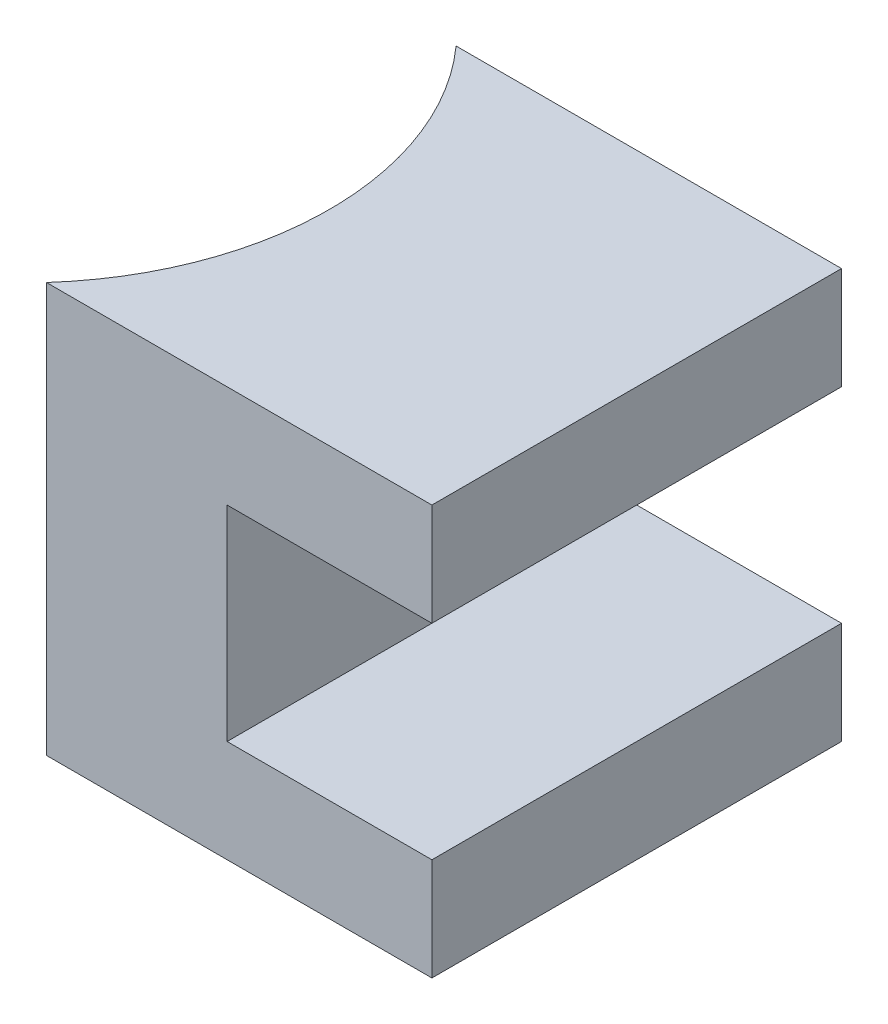
ISO-10303-21;
HEADER;
FILE_DESCRIPTION(('STEP AP214'),'2;1');
FILE_NAME('part.step','',(''),(''),'','','');
FILE_SCHEMA(('AUTOMOTIVE_DESIGN { 1 0 10303 214 1 1 1 1 }'));
ENDSEC;
DATA;
#1=APPLICATION_CONTEXT('core data for automotive mechanical design processes');
#2=APPLICATION_PROTOCOL_DEFINITION('international standard','automotive_design',2000,#1);
#3=PRODUCT_CONTEXT('',#1,'mechanical');
#4=PRODUCT('Part','Part','',(#3));
#5=PRODUCT_RELATED_PRODUCT_CATEGORY('part','',(#4));
#6=PRODUCT_DEFINITION_FORMATION('','',#4);
#7=PRODUCT_DEFINITION_CONTEXT('part definition',#1,'design');
#8=PRODUCT_DEFINITION('design','',#6,#7);
#9=PRODUCT_DEFINITION_SHAPE('','',#8);
#10=(LENGTH_UNIT() NAMED_UNIT(*) SI_UNIT(.MILLI.,.METRE.));
#11=(NAMED_UNIT(*) PLANE_ANGLE_UNIT() SI_UNIT($,.RADIAN.));
#12=(NAMED_UNIT(*) SI_UNIT($,.STERADIAN.) SOLID_ANGLE_UNIT());
#13=UNCERTAINTY_MEASURE_WITH_UNIT(LENGTH_MEASURE(1.E-05),#10,'distance_accuracy_value','');
#14=(GEOMETRIC_REPRESENTATION_CONTEXT(3) GLOBAL_UNCERTAINTY_ASSIGNED_CONTEXT((#13)) GLOBAL_UNIT_ASSIGNED_CONTEXT((#10,
#11,#12)) REPRESENTATION_CONTEXT('',''));
#15=CARTESIAN_POINT('',(0.,0.,0.));
#16=DIRECTION('',(0.,0.,1.));
#17=DIRECTION('',(1.,0.,0.));
#18=AXIS2_PLACEMENT_3D('',#15,#16,#17);
#19=CARTESIAN_POINT('',(30.,10.,-10.));
#20=DIRECTION('',(-1.,0.,0.));
#21=DIRECTION('',(0.,0.,1.));
#22=AXIS2_PLACEMENT_3D('',#19,#20,#21);
#23=PLANE('',#22);
#24=DIRECTION('',(0.,-1.,0.));
#25=VECTOR('',#24,1.);
#26=CARTESIAN_POINT('',(30.,10.,10.));
#27=LINE('',#26,#25);
#28=CARTESIAN_POINT('',(30.,10.,10.));
#29=VERTEX_POINT('',#28);
#30=CARTESIAN_POINT('',(30.,5.,10.));
#31=VERTEX_POINT('',#30);
#32=EDGE_CURVE('E185',#29,#31,#27,.T.);
#33=ORIENTED_EDGE('',*,*,#32,.T.);
#34=DIRECTION('',(0.,0.,-1.));
#35=VECTOR('',#34,1.);
#36=CARTESIAN_POINT('',(30.,5.,-10.));
#37=LINE('',#36,#35);
#38=CARTESIAN_POINT('',(30.,5.,-10.));
#39=VERTEX_POINT('',#38);
#40=EDGE_CURVE('E143',#31,#39,#37,.T.);
#41=ORIENTED_EDGE('',*,*,#40,.T.);
#42=DIRECTION('',(0.,-1.,0.));
#43=VECTOR('',#42,1.);
#44=CARTESIAN_POINT('',(30.,10.,-10.));
#45=LINE('',#44,#43);
#46=CARTESIAN_POINT('',(30.,10.,-10.));
#47=VERTEX_POINT('',#46);
#48=EDGE_CURVE('E181',#47,#39,#45,.T.);
#49=ORIENTED_EDGE('',*,*,#48,.F.);
#50=DIRECTION('',(0.,0.,-1.));
#51=VECTOR('',#50,1.);
#52=CARTESIAN_POINT('',(30.,10.,-10.));
#53=LINE('',#52,#51);
#54=EDGE_CURVE('E159',#29,#47,#53,.T.);
#55=ORIENTED_EDGE('',*,*,#54,.F.);
#56=EDGE_LOOP('',(#33,#41,#49,#55));
#57=FACE_BOUND('',#56,.T.);
#58=ADVANCED_FACE('F39',(#57),#23,.F.);
#59=CARTESIAN_POINT('',(0.,10.,0.));
#60=DIRECTION('',(0.,-1.,0.));
#61=DIRECTION('',(0.,0.,-1.));
#62=AXIS2_PLACEMENT_3D('',#59,#60,#61);
#63=CYLINDRICAL_SURFACE('',#62,15.);
#64=CARTESIAN_POINT('',(0.,-10.,0.));
#65=DIRECTION('',(0.,-1.,0.));
#66=DIRECTION('',(0.,0.,1.));
#67=AXIS2_PLACEMENT_3D('',#64,#65,#66);
#68=CIRCLE('',#67,15.);
#69=CARTESIAN_POINT('',(11.180339887499,-10.,-10.));
#70=VERTEX_POINT('',#69);
#71=CARTESIAN_POINT('',(11.1803398874989,-10.,10.));
#72=VERTEX_POINT('',#71);
#73=EDGE_CURVE('E153',#70,#72,#68,.T.);
#74=ORIENTED_EDGE('',*,*,#73,.T.);
#75=DIRECTION('',(0.,-1.,0.));
#76=VECTOR('',#75,1.);
#77=CARTESIAN_POINT('',(11.1803398874989,10.,10.));
#78=LINE('',#77,#76);
#79=CARTESIAN_POINT('',(11.1803398874989,10.,10.));
#80=VERTEX_POINT('',#79);
#81=EDGE_CURVE('E48',#80,#72,#78,.T.);
#82=ORIENTED_EDGE('',*,*,#81,.F.);
#83=CARTESIAN_POINT('',(0.,10.,0.));
#84=DIRECTION('',(0.,-1.,0.));
#85=DIRECTION('',(0.,0.,1.));
#86=AXIS2_PLACEMENT_3D('',#83,#84,#85);
#87=CIRCLE('',#86,15.);
#88=CARTESIAN_POINT('',(11.180339887499,10.,-10.));
#89=VERTEX_POINT('',#88);
#90=EDGE_CURVE('E154',#89,#80,#87,.T.);
#91=ORIENTED_EDGE('',*,*,#90,.F.);
#92=DIRECTION('',(0.,-1.,0.));
#93=VECTOR('',#92,1.);
#94=CARTESIAN_POINT('',(11.180339887499,10.,-10.));
#95=LINE('',#94,#93);
#96=EDGE_CURVE('E164',#89,#70,#95,.T.);
#97=ORIENTED_EDGE('',*,*,#96,.T.);
#98=EDGE_LOOP('',(#74,#82,#91,#97));
#99=FACE_BOUND('',#98,.T.);
#100=ADVANCED_FACE('F41',(#99),#63,.F.);
#101=CARTESIAN_POINT('',(30.,10.,10.));
#102=DIRECTION('',(0.,0.,-1.));
#103=DIRECTION('',(-1.,0.,0.));
#104=AXIS2_PLACEMENT_3D('',#101,#102,#103);
#105=PLANE('',#104);
#106=DIRECTION('',(0.,1.,0.));
#107=VECTOR('',#106,1.);
#108=CARTESIAN_POINT('',(20.,10.,10.));
#109=LINE('',#108,#107);
#110=CARTESIAN_POINT('',(20.,-5.,10.));
#111=VERTEX_POINT('',#110);
#112=CARTESIAN_POINT('',(20.,5.,10.));
#113=VERTEX_POINT('',#112);
#114=EDGE_CURVE('E121',#111,#113,#109,.T.);
#115=ORIENTED_EDGE('',*,*,#114,.T.);
#116=DIRECTION('',(1.,0.,0.));
#117=VECTOR('',#116,1.);
#118=CARTESIAN_POINT('',(30.,5.,10.));
#119=LINE('',#118,#117);
#120=EDGE_CURVE('E147',#113,#31,#119,.T.);
#121=ORIENTED_EDGE('',*,*,#120,.T.);
#122=ORIENTED_EDGE('',*,*,#32,.F.);
#123=DIRECTION('',(1.,0.,0.));
#124=VECTOR('',#123,1.);
#125=CARTESIAN_POINT('',(30.,10.,10.));
#126=LINE('',#125,#124);
#127=EDGE_CURVE('E92',#80,#29,#126,.T.);
#128=ORIENTED_EDGE('',*,*,#127,.F.);
#129=ORIENTED_EDGE('',*,*,#81,.T.);
#130=DIRECTION('',(1.,0.,0.));
#131=VECTOR('',#130,1.);
#132=CARTESIAN_POINT('',(30.,-10.,10.));
#133=LINE('',#132,#131);
#134=CARTESIAN_POINT('',(30.,-10.,10.));
#135=VERTEX_POINT('',#134);
#136=EDGE_CURVE('E168',#72,#135,#133,.T.);
#137=ORIENTED_EDGE('',*,*,#136,.T.);
#138=CARTESIAN_POINT('',(30.,-5.,10.));
#139=VERTEX_POINT('',#138);
#140=EDGE_CURVE('E184',#139,#135,#27,.T.);
#141=ORIENTED_EDGE('',*,*,#140,.F.);
#142=DIRECTION('',(-1.,0.,0.));
#143=VECTOR('',#142,1.);
#144=CARTESIAN_POINT('',(30.,-5.,10.));
#145=LINE('',#144,#143);
#146=EDGE_CURVE('E140',#139,#111,#145,.T.);
#147=ORIENTED_EDGE('',*,*,#146,.T.);
#148=EDGE_LOOP('',(#115,#121,#122,#128,#129,#137,#141,#147));
#149=FACE_BOUND('',#148,.T.);
#150=ADVANCED_FACE('F190',(#149),#105,.F.);
#151=CARTESIAN_POINT('',(30.,-5.,-10.));
#152=VERTEX_POINT('',#151);
#153=CARTESIAN_POINT('',(30.,-10.,-10.));
#154=VERTEX_POINT('',#153);
#155=EDGE_CURVE('E180',#152,#154,#45,.T.);
#156=ORIENTED_EDGE('',*,*,#155,.F.);
#157=DIRECTION('',(0.,0.,1.));
#158=VECTOR('',#157,1.);
#159=CARTESIAN_POINT('',(30.,-5.,-10.));
#160=LINE('',#159,#158);
#161=EDGE_CURVE('E55',#152,#139,#160,.T.);
#162=ORIENTED_EDGE('',*,*,#161,.T.);
#163=ORIENTED_EDGE('',*,*,#140,.T.);
#164=DIRECTION('',(0.,0.,-1.));
#165=VECTOR('',#164,1.);
#166=CARTESIAN_POINT('',(30.,-10.,-10.));
#167=LINE('',#166,#165);
#168=EDGE_CURVE('E172',#135,#154,#167,.T.);
#169=ORIENTED_EDGE('',*,*,#168,.T.);
#170=EDGE_LOOP('',(#156,#162,#163,#169));
#171=FACE_BOUND('',#170,.T.);
#172=ADVANCED_FACE('F199',(#171),#23,.F.);
#173=CARTESIAN_POINT('',(11.180339887499,10.,-10.));
#174=DIRECTION('',(0.,0.,1.));
#175=DIRECTION('',(1.,0.,0.));
#176=AXIS2_PLACEMENT_3D('',#173,#174,#175);
#177=PLANE('',#176);
#178=ORIENTED_EDGE('',*,*,#48,.T.);
#179=DIRECTION('',(-1.,0.,0.));
#180=VECTOR('',#179,1.);
#181=CARTESIAN_POINT('',(11.180339887499,5.,-10.));
#182=LINE('',#181,#180);
#183=CARTESIAN_POINT('',(20.,5.,-10.));
#184=VERTEX_POINT('',#183);
#185=EDGE_CURVE('E11',#39,#184,#182,.T.);
#186=ORIENTED_EDGE('',*,*,#185,.T.);
#187=DIRECTION('',(0.,-1.,0.));
#188=VECTOR('',#187,1.);
#189=CARTESIAN_POINT('',(20.,-5.,-10.));
#190=LINE('',#189,#188);
#191=CARTESIAN_POINT('',(20.,-5.,-10.));
#192=VERTEX_POINT('',#191);
#193=EDGE_CURVE('E119',#184,#192,#190,.T.);
#194=ORIENTED_EDGE('',*,*,#193,.T.);
#195=DIRECTION('',(1.,0.,0.));
#196=VECTOR('',#195,1.);
#197=CARTESIAN_POINT('',(35.2084250392566,-5.,-10.));
#198=LINE('',#197,#196);
#199=EDGE_CURVE('E125',#192,#152,#198,.T.);
#200=ORIENTED_EDGE('',*,*,#199,.T.);
#201=ORIENTED_EDGE('',*,*,#155,.T.);
#202=DIRECTION('',(-1.,0.,0.));
#203=VECTOR('',#202,1.);
#204=CARTESIAN_POINT('',(11.180339887499,-10.,-10.));
#205=LINE('',#204,#203);
#206=EDGE_CURVE('E84',#154,#70,#205,.T.);
#207=ORIENTED_EDGE('',*,*,#206,.T.);
#208=ORIENTED_EDGE('',*,*,#96,.F.);
#209=DIRECTION('',(-1.,0.,0.));
#210=VECTOR('',#209,1.);
#211=CARTESIAN_POINT('',(11.180339887499,10.,-10.));
#212=LINE('',#211,#210);
#213=EDGE_CURVE('E64',#47,#89,#212,.T.);
#214=ORIENTED_EDGE('',*,*,#213,.F.);
#215=EDGE_LOOP('',(#178,#186,#194,#200,#201,#207,#208,#214));
#216=FACE_BOUND('',#215,.T.);
#217=ADVANCED_FACE('F132',(#216),#177,.F.);
#218=CARTESIAN_POINT('',(0.,10.,0.));
#219=DIRECTION('',(0.,1.,0.));
#220=DIRECTION('',(0.,0.,1.));
#221=AXIS2_PLACEMENT_3D('',#218,#219,#220);
#222=PLANE('',#221);
#223=ORIENTED_EDGE('',*,*,#90,.T.);
#224=ORIENTED_EDGE('',*,*,#127,.T.);
#225=ORIENTED_EDGE('',*,*,#54,.T.);
#226=ORIENTED_EDGE('',*,*,#213,.T.);
#227=EDGE_LOOP('',(#223,#224,#225,#226));
#228=FACE_BOUND('',#227,.T.);
#229=ADVANCED_FACE('F206',(#228),#222,.T.);
#230=CARTESIAN_POINT('',(0.,-10.,0.));
#231=DIRECTION('',(0.,1.,0.));
#232=DIRECTION('',(0.,0.,1.));
#233=AXIS2_PLACEMENT_3D('',#230,#231,#232);
#234=PLANE('',#233);
#235=ORIENTED_EDGE('',*,*,#73,.F.);
#236=ORIENTED_EDGE('',*,*,#206,.F.);
#237=ORIENTED_EDGE('',*,*,#168,.F.);
#238=ORIENTED_EDGE('',*,*,#136,.F.);
#239=EDGE_LOOP('',(#235,#236,#237,#238));
#240=FACE_BOUND('',#239,.T.);
#241=ADVANCED_FACE('F197',(#240),#234,.F.);
#242=CARTESIAN_POINT('',(20.,-5.,-10.));
#243=DIRECTION('',(-1.,0.,0.));
#244=DIRECTION('',(0.,0.,1.));
#245=AXIS2_PLACEMENT_3D('',#242,#243,#244);
#246=PLANE('',#245);
#247=DIRECTION('',(0.,0.,1.));
#248=VECTOR('',#247,1.);
#249=CARTESIAN_POINT('',(20.,-5.,-10.));
#250=LINE('',#249,#248);
#251=EDGE_CURVE('E115',#192,#111,#250,.T.);
#252=ORIENTED_EDGE('',*,*,#251,.F.);
#253=ORIENTED_EDGE('',*,*,#193,.F.);
#254=DIRECTION('',(0.,0.,1.));
#255=VECTOR('',#254,1.);
#256=CARTESIAN_POINT('',(20.,5.,-10.));
#257=LINE('',#256,#255);
#258=EDGE_CURVE('E124',#184,#113,#257,.T.);
#259=ORIENTED_EDGE('',*,*,#258,.T.);
#260=ORIENTED_EDGE('',*,*,#114,.F.);
#261=EDGE_LOOP('',(#252,#253,#259,#260));
#262=FACE_BOUND('',#261,.T.);
#263=ADVANCED_FACE('F116',(#262),#246,.F.);
#264=CARTESIAN_POINT('',(20.,5.,-10.));
#265=DIRECTION('',(0.,1.,0.));
#266=DIRECTION('',(0.,0.,1.));
#267=AXIS2_PLACEMENT_3D('',#264,#265,#266);
#268=PLANE('',#267);
#269=ORIENTED_EDGE('',*,*,#258,.F.);
#270=ORIENTED_EDGE('',*,*,#185,.F.);
#271=ORIENTED_EDGE('',*,*,#40,.F.);
#272=ORIENTED_EDGE('',*,*,#120,.F.);
#273=EDGE_LOOP('',(#269,#270,#271,#272));
#274=FACE_BOUND('',#273,.T.);
#275=ADVANCED_FACE('F256',(#274),#268,.F.);
#276=CARTESIAN_POINT('',(35.2084250392566,-5.,-10.));
#277=DIRECTION('',(0.,-1.,0.));
#278=DIRECTION('',(1.,0.,0.));
#279=AXIS2_PLACEMENT_3D('',#276,#277,#278);
#280=PLANE('',#279);
#281=ORIENTED_EDGE('',*,*,#161,.F.);
#282=ORIENTED_EDGE('',*,*,#199,.F.);
#283=ORIENTED_EDGE('',*,*,#251,.T.);
#284=ORIENTED_EDGE('',*,*,#146,.F.);
#285=EDGE_LOOP('',(#281,#282,#283,#284));
#286=FACE_BOUND('',#285,.T.);
#287=ADVANCED_FACE('F127',(#286),#280,.F.);
#288=CLOSED_SHELL('',(#58,#100,#150,#172,#217,#229,#241,#263,#275,#287));
#289=MANIFOLD_SOLID_BREP('B2',#288);
#290=ADVANCED_BREP_SHAPE_REPRESENTATION('',(#18,#289),#14);
#291=SHAPE_DEFINITION_REPRESENTATION(#9,#290);
ENDSEC;
END-ISO-10303-21;
